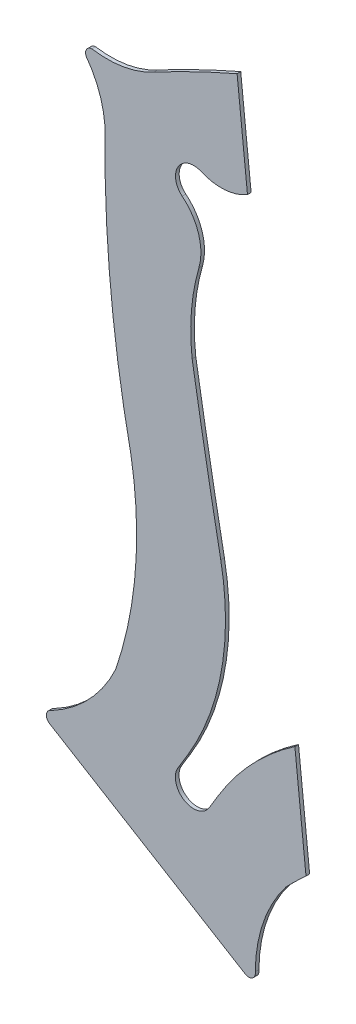
ISO-10303-21;
HEADER;
FILE_DESCRIPTION(('STEP AP214'),'2;1');
FILE_NAME('part.step','',(''),(''),'','','');
FILE_SCHEMA(('AUTOMOTIVE_DESIGN { 1 0 10303 214 1 1 1 1 }'));
ENDSEC;
DATA;
#1=APPLICATION_CONTEXT('core data for automotive mechanical design processes');
#2=APPLICATION_PROTOCOL_DEFINITION('international standard','automotive_design',2000,#1);
#3=PRODUCT_CONTEXT('',#1,'mechanical');
#4=PRODUCT('Part','Part','',(#3));
#5=PRODUCT_RELATED_PRODUCT_CATEGORY('part','',(#4));
#6=PRODUCT_DEFINITION_FORMATION('','',#4);
#7=PRODUCT_DEFINITION_CONTEXT('part definition',#1,'design');
#8=PRODUCT_DEFINITION('design','',#6,#7);
#9=PRODUCT_DEFINITION_SHAPE('','',#8);
#10=(LENGTH_UNIT() NAMED_UNIT(*) SI_UNIT(.MILLI.,.METRE.));
#11=(NAMED_UNIT(*) PLANE_ANGLE_UNIT() SI_UNIT($,.RADIAN.));
#12=(NAMED_UNIT(*) SI_UNIT($,.STERADIAN.) SOLID_ANGLE_UNIT());
#13=UNCERTAINTY_MEASURE_WITH_UNIT(LENGTH_MEASURE(1.E-05),#10,'distance_accuracy_value','');
#14=(GEOMETRIC_REPRESENTATION_CONTEXT(3) GLOBAL_UNCERTAINTY_ASSIGNED_CONTEXT((#13)) GLOBAL_UNIT_ASSIGNED_CONTEXT((#10,
#11,#12)) REPRESENTATION_CONTEXT('',''));
#15=CARTESIAN_POINT('',(0.,0.,0.));
#16=DIRECTION('',(0.,0.,1.));
#17=DIRECTION('',(1.,0.,0.));
#18=AXIS2_PLACEMENT_3D('',#15,#16,#17);
#19=CARTESIAN_POINT('',(-741.128045107195,819.426514046939,0.));
#20=DIRECTION('',(-0.994599825520508,-0.103784329619531,0.));
#21=DIRECTION('',(0.103784329619531,-0.994599825520508,0.));
#22=AXIS2_PLACEMENT_3D('',#19,#20,#21);
#23=PLANE('',#22);
#24=DIRECTION('',(0.103784329619531,-0.994599825520508,0.));
#25=VECTOR('',#24,1.);
#26=CARTESIAN_POINT('',(-433.648459855304,-2127.25284461701,6.35));
#27=LINE('',#26,#25);
#28=CARTESIAN_POINT('',(-728.290988065697,696.404717399258,6.35));
#29=VERTEX_POINT('',#28);
#30=CARTESIAN_POINT('',(-710.226925128052,523.29078091349,6.35));
#31=VERTEX_POINT('',#30);
#32=EDGE_CURVE('E44',#29,#31,#27,.T.);
#33=ORIENTED_EDGE('',*,*,#32,.T.);
#34=DIRECTION('',(0.,0.,-1.));
#35=VECTOR('',#34,1.);
#36=CARTESIAN_POINT('',(-710.226925128052,523.29078091349,6.35));
#37=LINE('',#36,#35);
#38=CARTESIAN_POINT('',(-710.226925128052,523.29078091349,0.));
#39=VERTEX_POINT('',#38);
#40=EDGE_CURVE('E289',#39,#31,#37,.F.);
#41=ORIENTED_EDGE('',*,*,#40,.F.);
#42=DIRECTION('',(0.103784329619531,-0.994599825520508,0.));
#43=VECTOR('',#42,1.);
#44=CARTESIAN_POINT('',(-433.648459855304,-2127.25284461701,0.));
#45=LINE('',#44,#43);
#46=CARTESIAN_POINT('',(-728.290988065697,696.404717399258,0.));
#47=VERTEX_POINT('',#46);
#48=EDGE_CURVE('E288',#47,#39,#45,.T.);
#49=ORIENTED_EDGE('',*,*,#48,.F.);
#50=DIRECTION('',(0.,0.,-1.));
#51=VECTOR('',#50,1.);
#52=CARTESIAN_POINT('',(-728.290988065698,696.404717399258,6.35));
#53=LINE('',#52,#51);
#54=EDGE_CURVE('E293',#29,#47,#53,.T.);
#55=ORIENTED_EDGE('',*,*,#54,.F.);
#56=EDGE_LOOP('',(#33,#41,#49,#55));
#57=FACE_BOUND('',#56,.T.);
#58=ADVANCED_FACE('F40',(#57),#23,.F.);
#59=DIRECTION('',(0.,0.,-1.));
#60=VECTOR('',#59,1.);
#61=CARTESIAN_POINT('',(-608.406270583659,-452.490491803614,6.35));
#62=LINE('',#61,#60);
#63=CARTESIAN_POINT('',(-608.406270583659,-452.490491803614,6.35));
#64=VERTEX_POINT('',#63);
#65=CARTESIAN_POINT('',(-608.406270583659,-452.490491803614,0.));
#66=VERTEX_POINT('',#65);
#67=EDGE_CURVE('E296',#64,#66,#62,.T.);
#68=ORIENTED_EDGE('',*,*,#67,.T.);
#69=CARTESIAN_POINT('',(-627.762456318267,-266.993711846947,0.));
#70=VERTEX_POINT('',#69);
#71=EDGE_CURVE('E284',#70,#66,#45,.T.);
#72=ORIENTED_EDGE('',*,*,#71,.F.);
#73=DIRECTION('',(0.,0.,-1.));
#74=VECTOR('',#73,1.);
#75=CARTESIAN_POINT('',(-627.762456318268,-266.993711846947,6.35));
#76=LINE('',#75,#74);
#77=CARTESIAN_POINT('',(-627.762456318267,-266.993711846947,6.35));
#78=VERTEX_POINT('',#77);
#79=EDGE_CURVE('E292',#78,#70,#76,.T.);
#80=ORIENTED_EDGE('',*,*,#79,.F.);
#81=EDGE_CURVE('E319',#78,#64,#27,.T.);
#82=ORIENTED_EDGE('',*,*,#81,.T.);
#83=EDGE_LOOP('',(#68,#72,#80,#82));
#84=FACE_BOUND('',#83,.T.);
#85=ADVANCED_FACE('F328',(#84),#23,.F.);
#86=CARTESIAN_POINT('',(-198.589222338844,-2102.72492418051,6.35));
#87=DIRECTION('',(0.,0.,1.));
#88=DIRECTION('',(1.,0.,0.));
#89=AXIS2_PLACEMENT_3D('',#86,#87,#88);
#90=PLANE('',#89);
#91=ORIENTED_EDGE('',*,*,#32,.F.);
#92=CARTESIAN_POINT('',(127.603997919187,-1261.36654521043,6.35));
#93=DIRECTION('',(0.,0.,1.));
#94=DIRECTION('',(1.,0.,0.));
#95=AXIS2_PLACEMENT_3D('',#92,#93,#94);
#96=CIRCLE('',#95,2136.68541056806);
#97=CARTESIAN_POINT('',(-872.836959201426,626.633040343017,6.35));
#98=VERTEX_POINT('',#97);
#99=EDGE_CURVE('E260',#29,#98,#96,.T.);
#100=ORIENTED_EDGE('',*,*,#99,.T.);
#101=CARTESIAN_POINT('',(-954.257934270492,772.469396121455,6.35));
#102=DIRECTION('',(0.,0.,1.));
#103=DIRECTION('',(1.,0.,0.));
#104=AXIS2_PLACEMENT_3D('',#101,#102,#103);
#105=CIRCLE('',#104,167.025799946992);
#106=CARTESIAN_POINT('',(-980.886171834159,607.579873069851,6.35));
#107=VERTEX_POINT('',#106);
#108=EDGE_CURVE('E257',#107,#98,#105,.T.);
#109=ORIENTED_EDGE('',*,*,#108,.F.);
#110=CARTESIAN_POINT('',(-980.252830325087,595.987624364916,6.35));
#111=DIRECTION('',(0.,0.,1.));
#112=DIRECTION('',(1.,0.,0.));
#113=AXIS2_PLACEMENT_3D('',#110,#111,#112);
#114=CIRCLE('',#113,11.6095370925895);
#115=CARTESIAN_POINT('',(-990.83596094201,591.214920953937,6.35));
#116=VERTEX_POINT('',#115);
#117=EDGE_CURVE('E255',#107,#116,#114,.T.);
#118=ORIENTED_EDGE('',*,*,#117,.T.);
#119=CARTESIAN_POINT('',(-1124.97081833669,491.688754145351,6.35));
#120=DIRECTION('',(0.,0.,1.));
#121=DIRECTION('',(1.,0.,0.));
#122=AXIS2_PLACEMENT_3D('',#119,#120,#121);
#123=CIRCLE('',#122,167.025799946898);
#124=CARTESIAN_POINT('',(-958.025023840061,486.519658693105,6.35));
#125=VERTEX_POINT('',#124);
#126=EDGE_CURVE('E252',#125,#116,#123,.T.);
#127=ORIENTED_EDGE('',*,*,#126,.F.);
#128=CARTESIAN_POINT('',(1178.57321293587,467.218924499953,6.35));
#129=DIRECTION('',(0.,0.,1.));
#130=DIRECTION('',(1.,0.,0.));
#131=AXIS2_PLACEMENT_3D('',#128,#129,#130);
#132=CIRCLE('',#131,2136.68541056806);
#133=CARTESIAN_POINT('',(-912.981608705125,30.3860367674515,6.35));
#134=VERTEX_POINT('',#133);
#135=EDGE_CURVE('E249',#125,#134,#132,.T.);
#136=ORIENTED_EDGE('',*,*,#135,.T.);
#137=CARTESIAN_POINT('',(-1587.3436409276,-86.1797164818334,6.35));
#138=DIRECTION('',(0.,0.,1.));
#139=DIRECTION('',(1.,0.,0.));
#140=AXIS2_PLACEMENT_3D('',#137,#138,#139);
#141=CIRCLE('',#140,684.362276381291);
#142=CARTESIAN_POINT('',(-939.301155204064,-306.163038647449,6.35));
#143=VERTEX_POINT('',#142);
#144=EDGE_CURVE('E245',#143,#134,#141,.T.);
#145=ORIENTED_EDGE('',*,*,#144,.F.);
#146=CARTESIAN_POINT('',(-1170.72395000322,-199.264411616122,6.35));
#147=DIRECTION('',(0.,0.,1.));
#148=DIRECTION('',(1.,0.,0.));
#149=AXIS2_PLACEMENT_3D('',#146,#147,#148);
#150=CIRCLE('',#149,254.919254694177);
#151=CARTESIAN_POINT('',(-1051.84855321285,-424.769326089758,6.35));
#152=VERTEX_POINT('',#151);
#153=EDGE_CURVE('E241',#152,#143,#150,.T.);
#154=ORIENTED_EDGE('',*,*,#153,.F.);
#155=CARTESIAN_POINT('',(-1048.49891237087,-435.885137249205,6.35));
#156=DIRECTION('',(0.,0.,1.));
#157=DIRECTION('',(1.,0.,0.));
#158=AXIS2_PLACEMENT_3D('',#155,#156,#157);
#159=CIRCLE('',#158,11.6095370925262);
#160=CARTESIAN_POINT('',(-1054.53017470375,-445.805078084444,6.35));
#161=VERTEX_POINT('',#160);
#162=EDGE_CURVE('E239',#152,#161,#159,.T.);
#163=ORIENTED_EDGE('',*,*,#162,.T.);
#164=DIRECTION('',(-0.854464803909352,0.519509286615891,0.));
#165=VECTOR('',#164,1.);
#166=CARTESIAN_POINT('',(305.911658058252,-1272.94525142689,6.35));
#167=LINE('',#166,#165);
#168=CARTESIAN_POINT('',(-714.115462783697,-652.775105795374,6.35));
#169=VERTEX_POINT('',#168);
#170=EDGE_CURVE('E236',#169,#161,#167,.T.);
#171=ORIENTED_EDGE('',*,*,#170,.F.);
#172=CARTESIAN_POINT('',(-708.084200450837,-642.855164960114,6.35));
#173=DIRECTION('',(0.,0.,1.));
#174=DIRECTION('',(1.,0.,0.));
#175=AXIS2_PLACEMENT_3D('',#172,#173,#174);
#176=CIRCLE('',#175,11.6095370925281);
#177=CARTESIAN_POINT('',(-696.673957545911,-640.713271322848,6.35));
#178=VERTEX_POINT('',#177);
#179=EDGE_CURVE('E233',#169,#178,#176,.T.);
#180=ORIENTED_EDGE('',*,*,#179,.T.);
#181=CARTESIAN_POINT('',(-441.76075257701,-642.469502020567,6.35));
#182=DIRECTION('',(0.,0.,1.));
#183=DIRECTION('',(1.,0.,0.));
#184=AXIS2_PLACEMENT_3D('',#181,#182,#183);
#185=CIRCLE('',#184,254.919254694079);
#186=CARTESIAN_POINT('',(-643.171312347398,-486.20814138793,6.35));
#187=VERTEX_POINT('',#186);
#188=EDGE_CURVE('E230',#187,#178,#185,.T.);
#189=ORIENTED_EDGE('',*,*,#188,.F.);
#190=CARTESIAN_POINT('',(-149.626818853529,-960.302602730689,6.35));
#191=DIRECTION('',(0.,0.,1.));
#192=DIRECTION('',(1.,0.,0.));
#193=AXIS2_PLACEMENT_3D('',#190,#191,#192);
#194=CIRCLE('',#193,684.362276381457);
#195=EDGE_CURVE('E234',#64,#187,#194,.T.);
#196=ORIENTED_EDGE('',*,*,#195,.F.);
#197=ORIENTED_EDGE('',*,*,#81,.F.);
#198=CARTESIAN_POINT('',(-370.075563141724,-644.656663544563,6.35));
#199=DIRECTION('',(0.,0.,1.));
#200=DIRECTION('',(1.,0.,0.));
#201=AXIS2_PLACEMENT_3D('',#198,#199,#200);
#202=CIRCLE('',#201,457.199999999929);
#203=CARTESIAN_POINT('',(-760.736871488665,-407.137017703093,6.35));
#204=VERTEX_POINT('',#203);
#205=EDGE_CURVE('E136',#78,#204,#202,.T.);
#206=ORIENTED_EDGE('',*,*,#205,.T.);
#207=DIRECTION('',(0.519509286618516,0.854464803907756,0.));
#208=VECTOR('',#207,1.);
#209=CARTESIAN_POINT('',(-1361.69444161737,-1395.56418453828,6.35));
#210=LINE('',#209,#208);
#211=CARTESIAN_POINT('',(-776.776730114399,-433.518633986711,6.35));
#212=VERTEX_POINT('',#211);
#213=EDGE_CURVE('E282',#212,#204,#210,.T.);
#214=ORIENTED_EDGE('',*,*,#213,.F.);
#215=CARTESIAN_POINT('',(-803.905987638729,-417.024214136529,6.35));
#216=DIRECTION('',(0.,0.,1.));
#217=DIRECTION('',(1.,0.,0.));
#218=AXIS2_PLACEMENT_3D('',#215,#216,#217);
#219=CIRCLE('',#218,31.7500000002434);
#220=CARTESIAN_POINT('',(-831.035245163057,-400.529794286347,6.35));
#221=VERTEX_POINT('',#220);
#222=EDGE_CURVE('E280',#221,#212,#219,.T.);
#223=ORIENTED_EDGE('',*,*,#222,.F.);
#224=DIRECTION('',(0.519509286618037,0.854464803908048,0.));
#225=VECTOR('',#224,1.);
#226=CARTESIAN_POINT('',(-1415.95295666581,-1362.57534483876,6.35));
#227=LINE('',#226,#225);
#228=CARTESIAN_POINT('',(-814.995386538354,-374.148178004392,6.35));
#229=VERTEX_POINT('',#228);
#230=EDGE_CURVE('E209',#221,#229,#227,.T.);
#231=ORIENTED_EDGE('',*,*,#230,.T.);
#232=CARTESIAN_POINT('',(-1205.65669488529,-136.628532162922,6.35));
#233=DIRECTION('',(0.,0.,1.));
#234=DIRECTION('',(1.,0.,0.));
#235=AXIS2_PLACEMENT_3D('',#232,#233,#234);
#236=CIRCLE('',#235,457.199999999937);
#237=CARTESIAN_POINT('',(-756.705863236947,-50.1705032575956,6.35));
#238=VERTEX_POINT('',#237);
#239=EDGE_CURVE('E276',#229,#238,#236,.T.);
#240=ORIENTED_EDGE('',*,*,#239,.T.);
#241=CARTESIAN_POINT('',(9925.35286515708,2006.95842304782,6.35));
#242=DIRECTION('',(0.,0.,1.));
#243=DIRECTION('',(1.,0.,0.));
#244=AXIS2_PLACEMENT_3D('',#241,#242,#243);
#245=CIRCLE('',#244,10878.3343438369);
#246=CARTESIAN_POINT('',(-806.495546800091,227.748553731484,6.35));
#247=VERTEX_POINT('',#246);
#248=EDGE_CURVE('E272',#247,#238,#245,.T.);
#249=ORIENTED_EDGE('',*,*,#248,.F.);
#250=CARTESIAN_POINT('',(-444.855573130135,269.976527238974,6.35));
#251=DIRECTION('',(0.,0.,1.));
#252=DIRECTION('',(1.,0.,0.));
#253=AXIS2_PLACEMENT_3D('',#250,#251,#252);
#254=CIRCLE('',#253,364.097064397058);
#255=CARTESIAN_POINT('',(-794.73477267855,370.729780416802,6.35));
#256=VERTEX_POINT('',#255);
#257=EDGE_CURVE('E268',#256,#247,#254,.T.);
#258=ORIENTED_EDGE('',*,*,#257,.F.);
#259=CARTESIAN_POINT('',(-880.16325832535,395.330264966837,6.35));
#260=DIRECTION('',(0.,0.,1.));
#261=DIRECTION('',(1.,0.,0.));
#262=AXIS2_PLACEMENT_3D('',#259,#260,#261);
#263=CIRCLE('',#262,88.9000000000047);
#264=CARTESIAN_POINT('',(-823.780399515816,464.06295902479,6.35));
#265=VERTEX_POINT('',#264);
#266=EDGE_CURVE('E264',#256,#265,#263,.T.);
#267=ORIENTED_EDGE('',*,*,#266,.T.);
#268=CARTESIAN_POINT('',(-803.643664226539,488.610349759959,6.35));
#269=DIRECTION('',(0.,0.,1.));
#270=DIRECTION('',(1.,0.,0.));
#271=AXIS2_PLACEMENT_3D('',#268,#269,#270);
#272=CIRCLE('',#271,31.7500000002444);
#273=CARTESIAN_POINT('',(-791.117705256406,517.78504516358,6.35));
#274=VERTEX_POINT('',#273);
#275=EDGE_CURVE('E261',#274,#265,#272,.T.);
#276=ORIENTED_EDGE('',*,*,#275,.F.);
#277=CARTESIAN_POINT('',(-756.045020140387,599.474192293135,6.35));
#278=DIRECTION('',(0.,0.,1.));
#279=DIRECTION('',(1.,0.,0.));
#280=AXIS2_PLACEMENT_3D('',#277,#278,#279);
#281=CIRCLE('',#280,88.8999999999977);
#282=EDGE_CURVE('E265',#274,#31,#281,.T.);
#283=ORIENTED_EDGE('',*,*,#282,.T.);
#284=EDGE_LOOP('',(#91,#100,#109,#118,#127,#136,#145,#154,#163,#171,#180,#189,#196,#197,#206,
#214,#223,#231,#240,#249,#258,#267,#276,#283));
#285=FACE_BOUND('',#284,.T.);
#286=ADVANCED_FACE('F338',(#285),#90,.T.);
#287=CARTESIAN_POINT('',(-198.589222338844,-2102.72492418051,0.));
#288=DIRECTION('',(0.,0.,1.));
#289=DIRECTION('',(1.,0.,0.));
#290=AXIS2_PLACEMENT_3D('',#287,#288,#289);
#291=PLANE('',#290);
#292=CARTESIAN_POINT('',(127.603997919187,-1261.36654521043,0.));
#293=DIRECTION('',(0.,0.,1.));
#294=DIRECTION('',(1.,0.,0.));
#295=AXIS2_PLACEMENT_3D('',#292,#293,#294);
#296=CIRCLE('',#295,2136.68541056806);
#297=CARTESIAN_POINT('',(-872.836959201426,626.633040343017,0.));
#298=VERTEX_POINT('',#297);
#299=EDGE_CURVE('E300',#47,#298,#296,.T.);
#300=ORIENTED_EDGE('',*,*,#299,.F.);
#301=ORIENTED_EDGE('',*,*,#48,.T.);
#302=CARTESIAN_POINT('',(-756.045020140387,599.474192293135,0.));
#303=DIRECTION('',(0.,0.,1.));
#304=DIRECTION('',(1.,0.,0.));
#305=AXIS2_PLACEMENT_3D('',#302,#303,#304);
#306=CIRCLE('',#305,88.8999999999977);
#307=CARTESIAN_POINT('',(-791.117705256406,517.78504516358,0.));
#308=VERTEX_POINT('',#307);
#309=EDGE_CURVE('E302',#308,#39,#306,.T.);
#310=ORIENTED_EDGE('',*,*,#309,.F.);
#311=CARTESIAN_POINT('',(-803.643664226539,488.610349759959,0.));
#312=DIRECTION('',(0.,0.,1.));
#313=DIRECTION('',(1.,0.,0.));
#314=AXIS2_PLACEMENT_3D('',#311,#312,#313);
#315=CIRCLE('',#314,31.7500000002444);
#316=CARTESIAN_POINT('',(-823.780399515816,464.06295902479,0.));
#317=VERTEX_POINT('',#316);
#318=EDGE_CURVE('E305',#308,#317,#315,.T.);
#319=ORIENTED_EDGE('',*,*,#318,.T.);
#320=CARTESIAN_POINT('',(-880.16325832535,395.330264966837,0.));
#321=DIRECTION('',(0.,0.,1.));
#322=DIRECTION('',(1.,0.,0.));
#323=AXIS2_PLACEMENT_3D('',#320,#321,#322);
#324=CIRCLE('',#323,88.9000000000047);
#325=CARTESIAN_POINT('',(-794.73477267855,370.729780416802,0.));
#326=VERTEX_POINT('',#325);
#327=EDGE_CURVE('E386',#326,#317,#324,.T.);
#328=ORIENTED_EDGE('',*,*,#327,.F.);
#329=CARTESIAN_POINT('',(-444.855573130135,269.976527238974,0.));
#330=DIRECTION('',(0.,0.,1.));
#331=DIRECTION('',(1.,0.,0.));
#332=AXIS2_PLACEMENT_3D('',#329,#330,#331);
#333=CIRCLE('',#332,364.097064397058);
#334=CARTESIAN_POINT('',(-806.495546800091,227.748553731484,0.));
#335=VERTEX_POINT('',#334);
#336=EDGE_CURVE('E390',#326,#335,#333,.T.);
#337=ORIENTED_EDGE('',*,*,#336,.T.);
#338=CARTESIAN_POINT('',(9925.35286515708,2006.95842304782,0.));
#339=DIRECTION('',(0.,0.,1.));
#340=DIRECTION('',(1.,0.,0.));
#341=AXIS2_PLACEMENT_3D('',#338,#339,#340);
#342=CIRCLE('',#341,10878.3343438369);
#343=CARTESIAN_POINT('',(-756.705863236947,-50.1705032575956,0.));
#344=VERTEX_POINT('',#343);
#345=EDGE_CURVE('E394',#335,#344,#342,.T.);
#346=ORIENTED_EDGE('',*,*,#345,.T.);
#347=CARTESIAN_POINT('',(-1205.65669488529,-136.628532162922,0.));
#348=DIRECTION('',(0.,0.,1.));
#349=DIRECTION('',(1.,0.,0.));
#350=AXIS2_PLACEMENT_3D('',#347,#348,#349);
#351=CIRCLE('',#350,457.199999999937);
#352=CARTESIAN_POINT('',(-814.995386538354,-374.148178004392,0.));
#353=VERTEX_POINT('',#352);
#354=EDGE_CURVE('E223',#353,#344,#351,.T.);
#355=ORIENTED_EDGE('',*,*,#354,.F.);
#356=DIRECTION('',(0.519509286618037,0.854464803908048,0.));
#357=VECTOR('',#356,1.);
#358=CARTESIAN_POINT('',(-1415.95295666581,-1362.57534483876,0.));
#359=LINE('',#358,#357);
#360=CARTESIAN_POINT('',(-831.035245163057,-400.529794286347,0.));
#361=VERTEX_POINT('',#360);
#362=EDGE_CURVE('E207',#361,#353,#359,.T.);
#363=ORIENTED_EDGE('',*,*,#362,.F.);
#364=CARTESIAN_POINT('',(-803.905987638729,-417.024214136529,0.));
#365=DIRECTION('',(0.,0.,1.));
#366=DIRECTION('',(1.,0.,0.));
#367=AXIS2_PLACEMENT_3D('',#364,#365,#366);
#368=CIRCLE('',#367,31.7500000002434);
#369=CARTESIAN_POINT('',(-776.776730114399,-433.518633986711,0.));
#370=VERTEX_POINT('',#369);
#371=EDGE_CURVE('E220',#361,#370,#368,.T.);
#372=ORIENTED_EDGE('',*,*,#371,.T.);
#373=DIRECTION('',(0.519509286618516,0.854464803907756,0.));
#374=VECTOR('',#373,1.);
#375=CARTESIAN_POINT('',(-1361.69444161737,-1395.56418453828,0.));
#376=LINE('',#375,#374);
#377=CARTESIAN_POINT('',(-760.736871488665,-407.137017703093,0.));
#378=VERTEX_POINT('',#377);
#379=EDGE_CURVE('E51',#370,#378,#376,.T.);
#380=ORIENTED_EDGE('',*,*,#379,.T.);
#381=CARTESIAN_POINT('',(-370.075563141724,-644.656663544563,0.));
#382=DIRECTION('',(0.,0.,1.));
#383=DIRECTION('',(1.,0.,0.));
#384=AXIS2_PLACEMENT_3D('',#381,#382,#383);
#385=CIRCLE('',#384,457.199999999929);
#386=EDGE_CURVE('E11',#70,#378,#385,.T.);
#387=ORIENTED_EDGE('',*,*,#386,.F.);
#388=ORIENTED_EDGE('',*,*,#71,.T.);
#389=CARTESIAN_POINT('',(-149.626818853529,-960.302602730689,0.));
#390=DIRECTION('',(0.,0.,1.));
#391=DIRECTION('',(1.,0.,0.));
#392=AXIS2_PLACEMENT_3D('',#389,#390,#391);
#393=CIRCLE('',#392,684.362276381457);
#394=CARTESIAN_POINT('',(-643.171312347398,-486.20814138793,0.));
#395=VERTEX_POINT('',#394);
#396=EDGE_CURVE('E144',#66,#395,#393,.T.);
#397=ORIENTED_EDGE('',*,*,#396,.T.);
#398=CARTESIAN_POINT('',(-441.76075257701,-642.469502020567,0.));
#399=DIRECTION('',(0.,0.,1.));
#400=DIRECTION('',(1.,0.,0.));
#401=AXIS2_PLACEMENT_3D('',#398,#399,#400);
#402=CIRCLE('',#401,254.919254694079);
#403=CARTESIAN_POINT('',(-696.673957545911,-640.713271322848,0.));
#404=VERTEX_POINT('',#403);
#405=EDGE_CURVE('E308',#395,#404,#402,.T.);
#406=ORIENTED_EDGE('',*,*,#405,.T.);
#407=CARTESIAN_POINT('',(-708.084200450837,-642.855164960114,0.));
#408=DIRECTION('',(0.,0.,1.));
#409=DIRECTION('',(1.,0.,0.));
#410=AXIS2_PLACEMENT_3D('',#407,#408,#409);
#411=CIRCLE('',#410,11.6095370925281);
#412=CARTESIAN_POINT('',(-714.115462783697,-652.775105795374,0.));
#413=VERTEX_POINT('',#412);
#414=EDGE_CURVE('E356',#413,#404,#411,.T.);
#415=ORIENTED_EDGE('',*,*,#414,.F.);
#416=DIRECTION('',(-0.854464803909352,0.519509286615891,0.));
#417=VECTOR('',#416,1.);
#418=CARTESIAN_POINT('',(305.911658058252,-1272.94525142689,0.));
#419=LINE('',#418,#417);
#420=CARTESIAN_POINT('',(-1054.53017470375,-445.805078084444,0.));
#421=VERTEX_POINT('',#420);
#422=EDGE_CURVE('E358',#413,#421,#419,.T.);
#423=ORIENTED_EDGE('',*,*,#422,.T.);
#424=CARTESIAN_POINT('',(-1048.49891237087,-435.885137249205,0.));
#425=DIRECTION('',(0.,0.,1.));
#426=DIRECTION('',(1.,0.,0.));
#427=AXIS2_PLACEMENT_3D('',#424,#425,#426);
#428=CIRCLE('',#427,11.6095370925262);
#429=CARTESIAN_POINT('',(-1051.84855321285,-424.769326089758,0.));
#430=VERTEX_POINT('',#429);
#431=EDGE_CURVE('E361',#430,#421,#428,.T.);
#432=ORIENTED_EDGE('',*,*,#431,.F.);
#433=CARTESIAN_POINT('',(-1170.72395000322,-199.264411616122,0.));
#434=DIRECTION('',(0.,0.,1.));
#435=DIRECTION('',(1.,0.,0.));
#436=AXIS2_PLACEMENT_3D('',#433,#434,#435);
#437=CIRCLE('',#436,254.919254694177);
#438=CARTESIAN_POINT('',(-939.301155204064,-306.163038647449,0.));
#439=VERTEX_POINT('',#438);
#440=EDGE_CURVE('E364',#430,#439,#437,.T.);
#441=ORIENTED_EDGE('',*,*,#440,.T.);
#442=CARTESIAN_POINT('',(-1587.3436409276,-86.1797164818334,0.));
#443=DIRECTION('',(0.,0.,1.));
#444=DIRECTION('',(1.,0.,0.));
#445=AXIS2_PLACEMENT_3D('',#442,#443,#444);
#446=CIRCLE('',#445,684.362276381291);
#447=CARTESIAN_POINT('',(-912.981608705125,30.3860367674515,0.));
#448=VERTEX_POINT('',#447);
#449=EDGE_CURVE('E368',#439,#448,#446,.T.);
#450=ORIENTED_EDGE('',*,*,#449,.T.);
#451=CARTESIAN_POINT('',(1178.57321293587,467.218924499953,0.));
#452=DIRECTION('',(0.,0.,1.));
#453=DIRECTION('',(1.,0.,0.));
#454=AXIS2_PLACEMENT_3D('',#451,#452,#453);
#455=CIRCLE('',#454,2136.68541056806);
#456=CARTESIAN_POINT('',(-958.025023840061,486.519658693105,0.));
#457=VERTEX_POINT('',#456);
#458=EDGE_CURVE('E372',#457,#448,#455,.T.);
#459=ORIENTED_EDGE('',*,*,#458,.F.);
#460=CARTESIAN_POINT('',(-1124.97081833669,491.688754145351,0.));
#461=DIRECTION('',(0.,0.,1.));
#462=DIRECTION('',(1.,0.,0.));
#463=AXIS2_PLACEMENT_3D('',#460,#461,#462);
#464=CIRCLE('',#463,167.025799946898);
#465=CARTESIAN_POINT('',(-990.83596094201,591.214920953937,0.));
#466=VERTEX_POINT('',#465);
#467=EDGE_CURVE('E376',#457,#466,#464,.T.);
#468=ORIENTED_EDGE('',*,*,#467,.T.);
#469=CARTESIAN_POINT('',(-980.252830325087,595.987624364916,0.));
#470=DIRECTION('',(0.,0.,1.));
#471=DIRECTION('',(1.,0.,0.));
#472=AXIS2_PLACEMENT_3D('',#469,#470,#471);
#473=CIRCLE('',#472,11.6095370925895);
#474=CARTESIAN_POINT('',(-980.886171834159,607.579873069851,0.));
#475=VERTEX_POINT('',#474);
#476=EDGE_CURVE('E379',#475,#466,#473,.T.);
#477=ORIENTED_EDGE('',*,*,#476,.F.);
#478=CARTESIAN_POINT('',(-954.257934270492,772.469396121455,0.));
#479=DIRECTION('',(0.,0.,1.));
#480=DIRECTION('',(1.,0.,0.));
#481=AXIS2_PLACEMENT_3D('',#478,#479,#480);
#482=CIRCLE('',#481,167.025799946992);
#483=EDGE_CURVE('E303',#475,#298,#482,.T.);
#484=ORIENTED_EDGE('',*,*,#483,.T.);
#485=EDGE_LOOP('',(#300,#301,#310,#319,#328,#337,#346,#355,#363,#372,#380,#387,#388,#397,#406,
#415,#423,#432,#441,#450,#459,#468,#477,#484));
#486=FACE_BOUND('',#485,.T.);
#487=ADVANCED_FACE('F42',(#486),#291,.F.);
#488=CARTESIAN_POINT('',(127.603997919187,-1261.36654521043,6.35));
#489=DIRECTION('',(0.,0.,-1.));
#490=DIRECTION('',(-1.,0.,0.));
#491=AXIS2_PLACEMENT_3D('',#488,#489,#490);
#492=CYLINDRICAL_SURFACE('',#491,2136.68541056806);
#493=ORIENTED_EDGE('',*,*,#99,.F.);
#494=ORIENTED_EDGE('',*,*,#54,.T.);
#495=ORIENTED_EDGE('',*,*,#299,.T.);
#496=DIRECTION('',(0.,0.,-1.));
#497=VECTOR('',#496,1.);
#498=CARTESIAN_POINT('',(-872.836959201426,626.633040343017,6.35));
#499=LINE('',#498,#497);
#500=EDGE_CURVE('E287',#98,#298,#499,.T.);
#501=ORIENTED_EDGE('',*,*,#500,.F.);
#502=EDGE_LOOP('',(#493,#494,#495,#501));
#503=FACE_BOUND('',#502,.T.);
#504=ADVANCED_FACE('F477',(#503),#492,.T.);
#505=CARTESIAN_POINT('',(-954.257934270492,772.469396121455,6.35));
#506=DIRECTION('',(0.,0.,-1.));
#507=DIRECTION('',(-1.,0.,0.));
#508=AXIS2_PLACEMENT_3D('',#505,#506,#507);
#509=CYLINDRICAL_SURFACE('',#508,167.025799946992);
#510=ORIENTED_EDGE('',*,*,#483,.F.);
#511=DIRECTION('',(0.,0.,-1.));
#512=VECTOR('',#511,1.);
#513=CARTESIAN_POINT('',(-980.886171834159,607.579873069851,6.35));
#514=LINE('',#513,#512);
#515=EDGE_CURVE('E423',#107,#475,#514,.T.);
#516=ORIENTED_EDGE('',*,*,#515,.F.);
#517=ORIENTED_EDGE('',*,*,#108,.T.);
#518=ORIENTED_EDGE('',*,*,#500,.T.);
#519=EDGE_LOOP('',(#510,#516,#517,#518));
#520=FACE_BOUND('',#519,.T.);
#521=ADVANCED_FACE('F472',(#520),#509,.F.);
#522=CARTESIAN_POINT('',(-980.252830325087,595.987624364916,6.35));
#523=DIRECTION('',(0.,0.,-1.));
#524=DIRECTION('',(-1.,0.,0.));
#525=AXIS2_PLACEMENT_3D('',#522,#523,#524);
#526=CYLINDRICAL_SURFACE('',#525,11.6095370925895);
#527=ORIENTED_EDGE('',*,*,#476,.T.);
#528=DIRECTION('',(0.,0.,-1.));
#529=VECTOR('',#528,1.);
#530=CARTESIAN_POINT('',(-990.83596094201,591.214920953937,6.35));
#531=LINE('',#530,#529);
#532=EDGE_CURVE('E425',#116,#466,#531,.T.);
#533=ORIENTED_EDGE('',*,*,#532,.F.);
#534=ORIENTED_EDGE('',*,*,#117,.F.);
#535=ORIENTED_EDGE('',*,*,#515,.T.);
#536=EDGE_LOOP('',(#527,#533,#534,#535));
#537=FACE_BOUND('',#536,.T.);
#538=ADVANCED_FACE('F469',(#537),#526,.T.);
#539=CARTESIAN_POINT('',(-1124.97081833669,491.688754145351,6.35));
#540=DIRECTION('',(0.,0.,-1.));
#541=DIRECTION('',(-1.,0.,0.));
#542=AXIS2_PLACEMENT_3D('',#539,#540,#541);
#543=CYLINDRICAL_SURFACE('',#542,167.025799946898);
#544=ORIENTED_EDGE('',*,*,#467,.F.);
#545=DIRECTION('',(0.,0.,-1.));
#546=VECTOR('',#545,1.);
#547=CARTESIAN_POINT('',(-958.025023840061,486.519658693105,6.35));
#548=LINE('',#547,#546);
#549=EDGE_CURVE('E427',#125,#457,#548,.T.);
#550=ORIENTED_EDGE('',*,*,#549,.F.);
#551=ORIENTED_EDGE('',*,*,#126,.T.);
#552=ORIENTED_EDGE('',*,*,#532,.T.);
#553=EDGE_LOOP('',(#544,#550,#551,#552));
#554=FACE_BOUND('',#553,.T.);
#555=ADVANCED_FACE('F463',(#554),#543,.F.);
#556=CARTESIAN_POINT('',(1178.57321293587,467.218924499953,6.35));
#557=DIRECTION('',(0.,0.,-1.));
#558=DIRECTION('',(-1.,0.,0.));
#559=AXIS2_PLACEMENT_3D('',#556,#557,#558);
#560=CYLINDRICAL_SURFACE('',#559,2136.68541056806);
#561=ORIENTED_EDGE('',*,*,#458,.T.);
#562=DIRECTION('',(0.,0.,-1.));
#563=VECTOR('',#562,1.);
#564=CARTESIAN_POINT('',(-912.981608705125,30.3860367674515,6.35));
#565=LINE('',#564,#563);
#566=EDGE_CURVE('E429',#134,#448,#565,.T.);
#567=ORIENTED_EDGE('',*,*,#566,.F.);
#568=ORIENTED_EDGE('',*,*,#135,.F.);
#569=ORIENTED_EDGE('',*,*,#549,.T.);
#570=EDGE_LOOP('',(#561,#567,#568,#569));
#571=FACE_BOUND('',#570,.T.);
#572=ADVANCED_FACE('F512',(#571),#560,.T.);
#573=CARTESIAN_POINT('',(-1587.3436409276,-86.1797164818334,6.35));
#574=DIRECTION('',(0.,0.,-1.));
#575=DIRECTION('',(-1.,0.,0.));
#576=AXIS2_PLACEMENT_3D('',#573,#574,#575);
#577=CYLINDRICAL_SURFACE('',#576,684.362276381291);
#578=ORIENTED_EDGE('',*,*,#449,.F.);
#579=DIRECTION('',(0.,0.,-1.));
#580=VECTOR('',#579,1.);
#581=CARTESIAN_POINT('',(-939.301155204064,-306.163038647449,6.35));
#582=LINE('',#581,#580);
#583=EDGE_CURVE('E432',#143,#439,#582,.T.);
#584=ORIENTED_EDGE('',*,*,#583,.F.);
#585=ORIENTED_EDGE('',*,*,#144,.T.);
#586=ORIENTED_EDGE('',*,*,#566,.T.);
#587=EDGE_LOOP('',(#578,#584,#585,#586));
#588=FACE_BOUND('',#587,.T.);
#589=ADVANCED_FACE('F456',(#588),#577,.F.);
#590=CARTESIAN_POINT('',(-1170.72395000322,-199.264411616122,6.35));
#591=DIRECTION('',(0.,0.,-1.));
#592=DIRECTION('',(-1.,0.,0.));
#593=AXIS2_PLACEMENT_3D('',#590,#591,#592);
#594=CYLINDRICAL_SURFACE('',#593,254.919254694177);
#595=ORIENTED_EDGE('',*,*,#440,.F.);
#596=DIRECTION('',(0.,0.,-1.));
#597=VECTOR('',#596,1.);
#598=CARTESIAN_POINT('',(-1051.84855321285,-424.769326089758,6.35));
#599=LINE('',#598,#597);
#600=EDGE_CURVE('E435',#152,#430,#599,.T.);
#601=ORIENTED_EDGE('',*,*,#600,.F.);
#602=ORIENTED_EDGE('',*,*,#153,.T.);
#603=ORIENTED_EDGE('',*,*,#583,.T.);
#604=EDGE_LOOP('',(#595,#601,#602,#603));
#605=FACE_BOUND('',#604,.T.);
#606=ADVANCED_FACE('F451',(#605),#594,.F.);
#607=CARTESIAN_POINT('',(-1048.49891237087,-435.885137249205,6.35));
#608=DIRECTION('',(0.,0.,-1.));
#609=DIRECTION('',(-1.,0.,0.));
#610=AXIS2_PLACEMENT_3D('',#607,#608,#609);
#611=CYLINDRICAL_SURFACE('',#610,11.6095370925262);
#612=ORIENTED_EDGE('',*,*,#431,.T.);
#613=DIRECTION('',(0.,0.,-1.));
#614=VECTOR('',#613,1.);
#615=CARTESIAN_POINT('',(-1054.53017470375,-445.805078084444,6.35));
#616=LINE('',#615,#614);
#617=EDGE_CURVE('E437',#161,#421,#616,.T.);
#618=ORIENTED_EDGE('',*,*,#617,.F.);
#619=ORIENTED_EDGE('',*,*,#162,.F.);
#620=ORIENTED_EDGE('',*,*,#600,.T.);
#621=EDGE_LOOP('',(#612,#618,#619,#620));
#622=FACE_BOUND('',#621,.T.);
#623=ADVANCED_FACE('F448',(#622),#611,.T.);
#624=CARTESIAN_POINT('',(305.911658058252,-1272.94525142689,6.35));
#625=DIRECTION('',(-0.519509286615891,-0.854464803909352,0.));
#626=DIRECTION('',(0.854464803909352,-0.519509286615891,0.));
#627=AXIS2_PLACEMENT_3D('',#624,#625,#626);
#628=PLANE('',#627);
#629=ORIENTED_EDGE('',*,*,#422,.F.);
#630=DIRECTION('',(0.,0.,-1.));
#631=VECTOR('',#630,1.);
#632=CARTESIAN_POINT('',(-714.115462783697,-652.775105795374,6.35));
#633=LINE('',#632,#631);
#634=EDGE_CURVE('E351',#169,#413,#633,.T.);
#635=ORIENTED_EDGE('',*,*,#634,.F.);
#636=ORIENTED_EDGE('',*,*,#170,.T.);
#637=ORIENTED_EDGE('',*,*,#617,.T.);
#638=EDGE_LOOP('',(#629,#635,#636,#637));
#639=FACE_BOUND('',#638,.T.);
#640=ADVANCED_FACE('F444',(#639),#628,.T.);
#641=CARTESIAN_POINT('',(-708.084200450837,-642.855164960114,6.35));
#642=DIRECTION('',(0.,0.,-1.));
#643=DIRECTION('',(-1.,0.,0.));
#644=AXIS2_PLACEMENT_3D('',#641,#642,#643);
#645=CYLINDRICAL_SURFACE('',#644,11.6095370925281);
#646=ORIENTED_EDGE('',*,*,#414,.T.);
#647=DIRECTION('',(0.,0.,-1.));
#648=VECTOR('',#647,1.);
#649=CARTESIAN_POINT('',(-696.673957545911,-640.713271322848,6.35));
#650=LINE('',#649,#648);
#651=EDGE_CURVE('E345',#178,#404,#650,.T.);
#652=ORIENTED_EDGE('',*,*,#651,.F.);
#653=ORIENTED_EDGE('',*,*,#179,.F.);
#654=ORIENTED_EDGE('',*,*,#634,.T.);
#655=EDGE_LOOP('',(#646,#652,#653,#654));
#656=FACE_BOUND('',#655,.T.);
#657=ADVANCED_FACE('F440',(#656),#645,.T.);
#658=CARTESIAN_POINT('',(-441.76075257701,-642.469502020567,6.35));
#659=DIRECTION('',(0.,0.,-1.));
#660=DIRECTION('',(-1.,0.,0.));
#661=AXIS2_PLACEMENT_3D('',#658,#659,#660);
#662=CYLINDRICAL_SURFACE('',#661,254.919254694079);
#663=ORIENTED_EDGE('',*,*,#405,.F.);
#664=DIRECTION('',(0.,0.,-1.));
#665=VECTOR('',#664,1.);
#666=CARTESIAN_POINT('',(-643.171312347398,-486.20814138793,6.35));
#667=LINE('',#666,#665);
#668=EDGE_CURVE('E347',#187,#395,#667,.T.);
#669=ORIENTED_EDGE('',*,*,#668,.F.);
#670=ORIENTED_EDGE('',*,*,#188,.T.);
#671=ORIENTED_EDGE('',*,*,#651,.T.);
#672=EDGE_LOOP('',(#663,#669,#670,#671));
#673=FACE_BOUND('',#672,.T.);
#674=ADVANCED_FACE('F344',(#673),#662,.F.);
#675=CARTESIAN_POINT('',(-149.626818853529,-960.302602730689,6.35));
#676=DIRECTION('',(0.,0.,-1.));
#677=DIRECTION('',(-1.,0.,0.));
#678=AXIS2_PLACEMENT_3D('',#675,#676,#677);
#679=CYLINDRICAL_SURFACE('',#678,684.362276381457);
#680=ORIENTED_EDGE('',*,*,#67,.F.);
#681=ORIENTED_EDGE('',*,*,#195,.T.);
#682=ORIENTED_EDGE('',*,*,#668,.T.);
#683=ORIENTED_EDGE('',*,*,#396,.F.);
#684=EDGE_LOOP('',(#680,#681,#682,#683));
#685=FACE_BOUND('',#684,.T.);
#686=ADVANCED_FACE('F335',(#685),#679,.F.);
#687=CARTESIAN_POINT('',(-370.075563141724,-644.656663544563,6.35));
#688=DIRECTION('',(0.,0.,-1.));
#689=DIRECTION('',(-1.,0.,0.));
#690=AXIS2_PLACEMENT_3D('',#687,#688,#689);
#691=CYLINDRICAL_SURFACE('',#690,457.199999999929);
#692=ORIENTED_EDGE('',*,*,#205,.F.);
#693=ORIENTED_EDGE('',*,*,#79,.T.);
#694=ORIENTED_EDGE('',*,*,#386,.T.);
#695=DIRECTION('',(0.,0.,-1.));
#696=VECTOR('',#695,1.);
#697=CARTESIAN_POINT('',(-760.736871488665,-407.137017703093,6.35));
#698=LINE('',#697,#696);
#699=EDGE_CURVE('E348',#204,#378,#698,.T.);
#700=ORIENTED_EDGE('',*,*,#699,.F.);
#701=EDGE_LOOP('',(#692,#693,#694,#700));
#702=FACE_BOUND('',#701,.T.);
#703=ADVANCED_FACE('F487',(#702),#691,.T.);
#704=CARTESIAN_POINT('',(-1361.69444161737,-1395.56418453828,6.35));
#705=DIRECTION('',(-0.854464803907756,0.519509286618516,0.));
#706=DIRECTION('',(-0.519509286618516,-0.854464803907756,0.));
#707=AXIS2_PLACEMENT_3D('',#704,#705,#706);
#708=PLANE('',#707);
#709=ORIENTED_EDGE('',*,*,#379,.F.);
#710=DIRECTION('',(0.,0.,-1.));
#711=VECTOR('',#710,1.);
#712=CARTESIAN_POINT('',(-776.776730114399,-433.518633986711,6.35));
#713=LINE('',#712,#711);
#714=EDGE_CURVE('E129',#212,#370,#713,.T.);
#715=ORIENTED_EDGE('',*,*,#714,.F.);
#716=ORIENTED_EDGE('',*,*,#213,.T.);
#717=ORIENTED_EDGE('',*,*,#699,.T.);
#718=EDGE_LOOP('',(#709,#715,#716,#717));
#719=FACE_BOUND('',#718,.T.);
#720=ADVANCED_FACE('F490',(#719),#708,.T.);
#721=CARTESIAN_POINT('',(-803.905987638729,-417.024214136529,6.35));
#722=DIRECTION('',(0.,0.,-1.));
#723=DIRECTION('',(-1.,0.,0.));
#724=AXIS2_PLACEMENT_3D('',#721,#722,#723);
#725=CYLINDRICAL_SURFACE('',#724,31.7500000002434);
#726=ORIENTED_EDGE('',*,*,#371,.F.);
#727=DIRECTION('',(0.,0.,-1.));
#728=VECTOR('',#727,1.);
#729=CARTESIAN_POINT('',(-831.035245163057,-400.529794286347,6.35));
#730=LINE('',#729,#728);
#731=EDGE_CURVE('E203',#221,#361,#730,.T.);
#732=ORIENTED_EDGE('',*,*,#731,.F.);
#733=ORIENTED_EDGE('',*,*,#222,.T.);
#734=ORIENTED_EDGE('',*,*,#714,.T.);
#735=EDGE_LOOP('',(#726,#732,#733,#734));
#736=FACE_BOUND('',#735,.T.);
#737=ADVANCED_FACE('F225',(#736),#725,.F.);
#738=CARTESIAN_POINT('',(-1415.95295666581,-1362.57534483876,6.35));
#739=DIRECTION('',(-0.854464803908048,0.519509286618036,0.));
#740=DIRECTION('',(-0.519509286618037,-0.854464803908048,0.));
#741=AXIS2_PLACEMENT_3D('',#738,#739,#740);
#742=PLANE('',#741);
#743=ORIENTED_EDGE('',*,*,#362,.T.);
#744=DIRECTION('',(0.,0.,-1.));
#745=VECTOR('',#744,1.);
#746=CARTESIAN_POINT('',(-814.995386538354,-374.148178004392,6.35));
#747=LINE('',#746,#745);
#748=EDGE_CURVE('E214',#229,#353,#747,.T.);
#749=ORIENTED_EDGE('',*,*,#748,.F.);
#750=ORIENTED_EDGE('',*,*,#230,.F.);
#751=ORIENTED_EDGE('',*,*,#731,.T.);
#752=EDGE_LOOP('',(#743,#749,#750,#751));
#753=FACE_BOUND('',#752,.T.);
#754=ADVANCED_FACE('F205',(#753),#742,.F.);
#755=CARTESIAN_POINT('',(-1205.65669488529,-136.628532162922,6.35));
#756=DIRECTION('',(0.,0.,-1.));
#757=DIRECTION('',(-1.,0.,0.));
#758=AXIS2_PLACEMENT_3D('',#755,#756,#757);
#759=CYLINDRICAL_SURFACE('',#758,457.199999999937);
#760=ORIENTED_EDGE('',*,*,#354,.T.);
#761=DIRECTION('',(0.,0.,-1.));
#762=VECTOR('',#761,1.);
#763=CARTESIAN_POINT('',(-756.705863236947,-50.1705032575956,6.35));
#764=LINE('',#763,#762);
#765=EDGE_CURVE('E402',#238,#344,#764,.T.);
#766=ORIENTED_EDGE('',*,*,#765,.F.);
#767=ORIENTED_EDGE('',*,*,#239,.F.);
#768=ORIENTED_EDGE('',*,*,#748,.T.);
#769=EDGE_LOOP('',(#760,#766,#767,#768));
#770=FACE_BOUND('',#769,.T.);
#771=ADVANCED_FACE('F400',(#770),#759,.T.);
#772=CARTESIAN_POINT('',(9925.35286515708,2006.95842304782,6.35));
#773=DIRECTION('',(0.,0.,-1.));
#774=DIRECTION('',(-1.,0.,0.));
#775=AXIS2_PLACEMENT_3D('',#772,#773,#774);
#776=CYLINDRICAL_SURFACE('',#775,10878.3343438369);
#777=ORIENTED_EDGE('',*,*,#345,.F.);
#778=DIRECTION('',(0.,0.,-1.));
#779=VECTOR('',#778,1.);
#780=CARTESIAN_POINT('',(-806.495546800091,227.748553731484,6.35));
#781=LINE('',#780,#779);
#782=EDGE_CURVE('E408',#247,#335,#781,.T.);
#783=ORIENTED_EDGE('',*,*,#782,.F.);
#784=ORIENTED_EDGE('',*,*,#248,.T.);
#785=ORIENTED_EDGE('',*,*,#765,.T.);
#786=EDGE_LOOP('',(#777,#783,#784,#785));
#787=FACE_BOUND('',#786,.T.);
#788=ADVANCED_FACE('F407',(#787),#776,.F.);
#789=CARTESIAN_POINT('',(-444.855573130135,269.976527238974,6.35));
#790=DIRECTION('',(0.,0.,-1.));
#791=DIRECTION('',(-1.,0.,0.));
#792=AXIS2_PLACEMENT_3D('',#789,#790,#791);
#793=CYLINDRICAL_SURFACE('',#792,364.097064397058);
#794=ORIENTED_EDGE('',*,*,#336,.F.);
#795=DIRECTION('',(0.,0.,-1.));
#796=VECTOR('',#795,1.);
#797=CARTESIAN_POINT('',(-794.73477267855,370.729780416802,6.35));
#798=LINE('',#797,#796);
#799=EDGE_CURVE('E412',#256,#326,#798,.T.);
#800=ORIENTED_EDGE('',*,*,#799,.F.);
#801=ORIENTED_EDGE('',*,*,#257,.T.);
#802=ORIENTED_EDGE('',*,*,#782,.T.);
#803=EDGE_LOOP('',(#794,#800,#801,#802));
#804=FACE_BOUND('',#803,.T.);
#805=ADVANCED_FACE('F493',(#804),#793,.F.);
#806=CARTESIAN_POINT('',(-880.16325832535,395.330264966837,6.35));
#807=DIRECTION('',(0.,0.,-1.));
#808=DIRECTION('',(-1.,0.,0.));
#809=AXIS2_PLACEMENT_3D('',#806,#807,#808);
#810=CYLINDRICAL_SURFACE('',#809,88.9000000000047);
#811=ORIENTED_EDGE('',*,*,#327,.T.);
#812=DIRECTION('',(0.,0.,-1.));
#813=VECTOR('',#812,1.);
#814=CARTESIAN_POINT('',(-823.780399515816,464.06295902479,6.35));
#815=LINE('',#814,#813);
#816=EDGE_CURVE('E418',#265,#317,#815,.T.);
#817=ORIENTED_EDGE('',*,*,#816,.F.);
#818=ORIENTED_EDGE('',*,*,#266,.F.);
#819=ORIENTED_EDGE('',*,*,#799,.T.);
#820=EDGE_LOOP('',(#811,#817,#818,#819));
#821=FACE_BOUND('',#820,.T.);
#822=ADVANCED_FACE('F497',(#821),#810,.T.);
#823=CARTESIAN_POINT('',(-803.643664226539,488.610349759959,6.35));
#824=DIRECTION('',(0.,0.,-1.));
#825=DIRECTION('',(-1.,0.,0.));
#826=AXIS2_PLACEMENT_3D('',#823,#824,#825);
#827=CYLINDRICAL_SURFACE('',#826,31.7500000002444);
#828=ORIENTED_EDGE('',*,*,#318,.F.);
#829=DIRECTION('',(0.,0.,-1.));
#830=VECTOR('',#829,1.);
#831=CARTESIAN_POINT('',(-791.117705256406,517.78504516358,6.35));
#832=LINE('',#831,#830);
#833=EDGE_CURVE('E311',#274,#308,#832,.T.);
#834=ORIENTED_EDGE('',*,*,#833,.F.);
#835=ORIENTED_EDGE('',*,*,#275,.T.);
#836=ORIENTED_EDGE('',*,*,#816,.T.);
#837=EDGE_LOOP('',(#828,#834,#835,#836));
#838=FACE_BOUND('',#837,.T.);
#839=ADVANCED_FACE('F502',(#838),#827,.F.);
#840=CARTESIAN_POINT('',(-756.045020140387,599.474192293135,6.35));
#841=DIRECTION('',(0.,0.,-1.));
#842=DIRECTION('',(-1.,0.,0.));
#843=AXIS2_PLACEMENT_3D('',#840,#841,#842);
#844=CYLINDRICAL_SURFACE('',#843,88.8999999999977);
#845=ORIENTED_EDGE('',*,*,#309,.T.);
#846=ORIENTED_EDGE('',*,*,#40,.T.);
#847=ORIENTED_EDGE('',*,*,#282,.F.);
#848=ORIENTED_EDGE('',*,*,#833,.T.);
#849=EDGE_LOOP('',(#845,#846,#847,#848));
#850=FACE_BOUND('',#849,.T.);
#851=ADVANCED_FACE('F504',(#850),#844,.T.);
#852=CLOSED_SHELL('',(#58,#85,#286,#487,#504,#521,#538,#555,#572,#589,#606,#623,#640,#657,#674,
#686,#703,#720,#737,#754,#771,#788,#805,#822,#839,#851));
#853=MANIFOLD_SOLID_BREP('B2',#852);
#854=ADVANCED_BREP_SHAPE_REPRESENTATION('',(#18,#853),#14);
#855=SHAPE_DEFINITION_REPRESENTATION(#9,#854);
ENDSEC;
END-ISO-10303-21;
